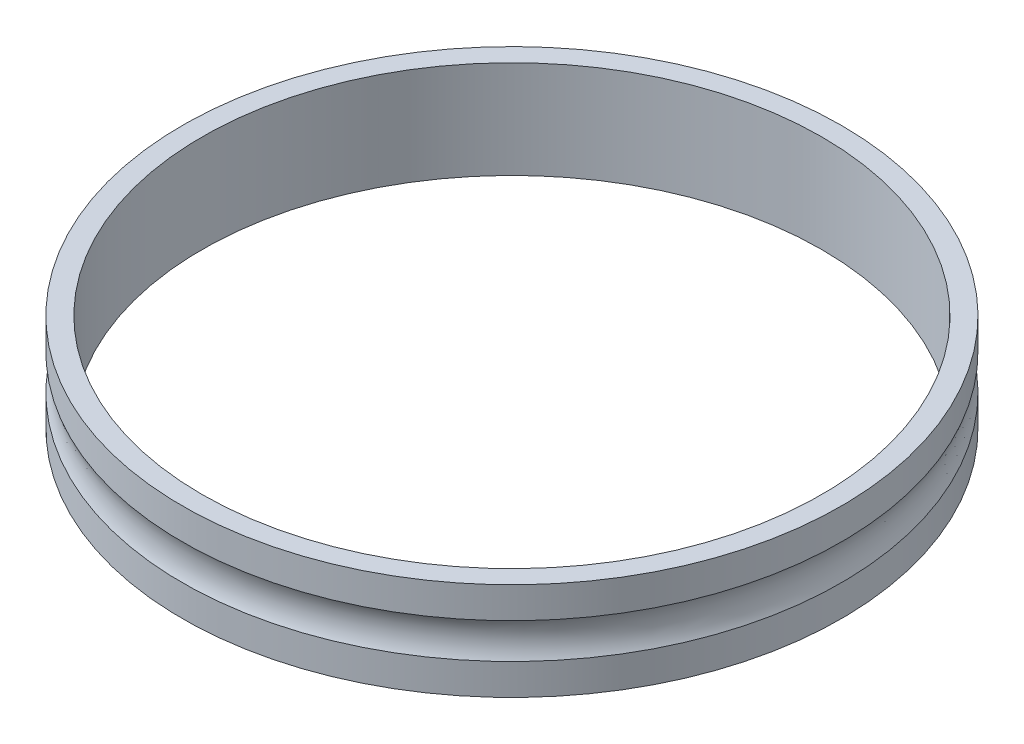
ISO-10303-21;
HEADER;
FILE_DESCRIPTION(('STEP AP214'),'2;1');
FILE_NAME('part.step','',(''),(''),'','','');
FILE_SCHEMA(('AUTOMOTIVE_DESIGN { 1 0 10303 214 1 1 1 1 }'));
ENDSEC;
DATA;
#1=APPLICATION_CONTEXT('core data for automotive mechanical design processes');
#2=APPLICATION_PROTOCOL_DEFINITION('international standard','automotive_design',2000,#1);
#3=PRODUCT_CONTEXT('',#1,'mechanical');
#4=PRODUCT('Part','Part','',(#3));
#5=PRODUCT_RELATED_PRODUCT_CATEGORY('part','',(#4));
#6=PRODUCT_DEFINITION_FORMATION('','',#4);
#7=PRODUCT_DEFINITION_CONTEXT('part definition',#1,'design');
#8=PRODUCT_DEFINITION('design','',#6,#7);
#9=PRODUCT_DEFINITION_SHAPE('','',#8);
#10=(LENGTH_UNIT() NAMED_UNIT(*) SI_UNIT(.MILLI.,.METRE.));
#11=(NAMED_UNIT(*) PLANE_ANGLE_UNIT() SI_UNIT($,.RADIAN.));
#12=(NAMED_UNIT(*) SI_UNIT($,.STERADIAN.) SOLID_ANGLE_UNIT());
#13=UNCERTAINTY_MEASURE_WITH_UNIT(LENGTH_MEASURE(1.E-05),#10,'distance_accuracy_value','');
#14=(GEOMETRIC_REPRESENTATION_CONTEXT(3) GLOBAL_UNCERTAINTY_ASSIGNED_CONTEXT((#13)) GLOBAL_UNIT_ASSIGNED_CONTEXT((#10,
#11,#12)) REPRESENTATION_CONTEXT('',''));
#15=CARTESIAN_POINT('',(0.,0.,0.));
#16=DIRECTION('',(0.,0.,1.));
#17=DIRECTION('',(1.,0.,0.));
#18=AXIS2_PLACEMENT_3D('',#15,#16,#17);
#19=CARTESIAN_POINT('',(12.535,-1.2,0.));
#20=DIRECTION('',(0.,-1.,0.));
#21=DIRECTION('',(0.,0.,-1.));
#22=AXIS2_PLACEMENT_3D('',#19,#20,#21);
#23=PLANE('',#22);
#24=CARTESIAN_POINT('',(0.,-1.2,0.));
#25=DIRECTION('',(0.,-1.,0.));
#26=DIRECTION('',(0.,0.,-1.));
#27=AXIS2_PLACEMENT_3D('',#24,#25,#26);
#28=CIRCLE('',#27,13.335);
#29=CARTESIAN_POINT('',(0.,-1.2,-13.335));
#30=VERTEX_POINT('',#29);
#31=EDGE_CURVE('E28',#30,#30,#28,.T.);
#32=ORIENTED_EDGE('',*,*,#31,.F.);
#33=EDGE_LOOP('',(#32));
#34=FACE_BOUND('',#33,.T.);
#35=CARTESIAN_POINT('',(0.,-1.2,0.));
#36=DIRECTION('',(0.,-1.,0.));
#37=DIRECTION('',(0.,0.,-1.));
#38=AXIS2_PLACEMENT_3D('',#35,#36,#37);
#39=CIRCLE('',#38,12.535);
#40=CARTESIAN_POINT('',(0.,-1.2,-12.535));
#41=VERTEX_POINT('',#40);
#42=EDGE_CURVE('E11',#41,#41,#39,.T.);
#43=ORIENTED_EDGE('',*,*,#42,.T.);
#44=EDGE_LOOP('',(#43));
#45=FACE_BOUND('',#44,.T.);
#46=ADVANCED_FACE('F17',(#34,#45),#23,.F.);
#47=CARTESIAN_POINT('',(0.,0.,0.));
#48=DIRECTION('',(0.,-1.,0.));
#49=DIRECTION('',(0.,0.,-1.));
#50=AXIS2_PLACEMENT_3D('',#47,#48,#49);
#51=CYLINDRICAL_SURFACE('',#50,13.335);
#52=CARTESIAN_POINT('',(0.,-2.46029184277775,0.));
#53=DIRECTION('',(0.,-1.,0.));
#54=DIRECTION('',(0.,0.,-1.));
#55=AXIS2_PLACEMENT_3D('',#52,#53,#54);
#56=CIRCLE('',#55,13.335);
#57=CARTESIAN_POINT('',(0.,-2.46029184277775,-13.335));
#58=VERTEX_POINT('',#57);
#59=EDGE_CURVE('E63',#58,#58,#56,.T.);
#60=ORIENTED_EDGE('',*,*,#59,.F.);
#61=EDGE_LOOP('',(#60));
#62=FACE_BOUND('',#61,.T.);
#63=ORIENTED_EDGE('',*,*,#31,.T.);
#64=EDGE_LOOP('',(#63));
#65=FACE_BOUND('',#64,.T.);
#66=ADVANCED_FACE('F72',(#62,#65),#51,.T.);
#67=CARTESIAN_POINT('',(0.,-3.175,0.));
#68=DIRECTION('',(0.,-1.,0.));
#69=DIRECTION('',(0.,0.,-1.));
#70=AXIS2_PLACEMENT_3D('',#67,#68,#69);
#71=TOROIDAL_SURFACE('',#70,14.7665,1.6);
#72=CARTESIAN_POINT('',(0.,-3.8897081572223,0.));
#73=DIRECTION('',(0.,-1.,0.));
#74=DIRECTION('',(0.,0.,-1.));
#75=AXIS2_PLACEMENT_3D('',#72,#73,#74);
#76=CIRCLE('',#75,13.335);
#77=CARTESIAN_POINT('',(0.,-3.8897081572223,-13.335));
#78=VERTEX_POINT('',#77);
#79=EDGE_CURVE('E59',#78,#78,#76,.T.);
#80=ORIENTED_EDGE('',*,*,#79,.F.);
#81=EDGE_LOOP('',(#80));
#82=FACE_BOUND('',#81,.T.);
#83=ORIENTED_EDGE('',*,*,#59,.T.);
#84=EDGE_LOOP('',(#83));
#85=FACE_BOUND('',#84,.T.);
#86=ADVANCED_FACE('F74',(#82,#85),#71,.F.);
#87=CARTESIAN_POINT('',(0.,0.,0.));
#88=DIRECTION('',(0.,-1.,0.));
#89=DIRECTION('',(0.,0.,-1.));
#90=AXIS2_PLACEMENT_3D('',#87,#88,#89);
#91=CYLINDRICAL_SURFACE('',#90,13.335);
#92=CARTESIAN_POINT('',(0.,-5.15,0.));
#93=DIRECTION('',(0.,-1.,0.));
#94=DIRECTION('',(0.,0.,-1.));
#95=AXIS2_PLACEMENT_3D('',#92,#93,#94);
#96=CIRCLE('',#95,13.335);
#97=CARTESIAN_POINT('',(0.,-5.15,-13.335));
#98=VERTEX_POINT('',#97);
#99=EDGE_CURVE('E47',#98,#98,#96,.T.);
#100=ORIENTED_EDGE('',*,*,#99,.F.);
#101=EDGE_LOOP('',(#100));
#102=FACE_BOUND('',#101,.T.);
#103=ORIENTED_EDGE('',*,*,#79,.T.);
#104=EDGE_LOOP('',(#103));
#105=FACE_BOUND('',#104,.T.);
#106=ADVANCED_FACE('F82',(#102,#105),#91,.T.);
#107=CARTESIAN_POINT('',(13.335,-5.15,0.));
#108=DIRECTION('',(0.,1.,0.));
#109=DIRECTION('',(0.,0.,1.));
#110=AXIS2_PLACEMENT_3D('',#107,#108,#109);
#111=PLANE('',#110);
#112=CARTESIAN_POINT('',(0.,-5.15,0.));
#113=DIRECTION('',(0.,-1.,0.));
#114=DIRECTION('',(0.,0.,-1.));
#115=AXIS2_PLACEMENT_3D('',#112,#113,#114);
#116=CIRCLE('',#115,12.535);
#117=CARTESIAN_POINT('',(0.,-5.15,-12.535));
#118=VERTEX_POINT('',#117);
#119=EDGE_CURVE('E21',#118,#118,#116,.T.);
#120=ORIENTED_EDGE('',*,*,#119,.F.);
#121=EDGE_LOOP('',(#120));
#122=FACE_BOUND('',#121,.T.);
#123=ORIENTED_EDGE('',*,*,#99,.T.);
#124=EDGE_LOOP('',(#123));
#125=FACE_BOUND('',#124,.T.);
#126=ADVANCED_FACE('F51',(#122,#125),#111,.F.);
#127=CARTESIAN_POINT('',(0.,0.,0.));
#128=DIRECTION('',(0.,-1.,0.));
#129=DIRECTION('',(0.,0.,-1.));
#130=AXIS2_PLACEMENT_3D('',#127,#128,#129);
#131=CYLINDRICAL_SURFACE('',#130,12.535);
#132=ORIENTED_EDGE('',*,*,#42,.F.);
#133=EDGE_LOOP('',(#132));
#134=FACE_BOUND('',#133,.T.);
#135=ORIENTED_EDGE('',*,*,#119,.T.);
#136=EDGE_LOOP('',(#135));
#137=FACE_BOUND('',#136,.T.);
#138=ADVANCED_FACE('F19',(#134,#137),#131,.F.);
#139=CLOSED_SHELL('',(#46,#66,#86,#106,#126,#138));
#140=MANIFOLD_SOLID_BREP('B1',#139);
#141=ADVANCED_BREP_SHAPE_REPRESENTATION('',(#18,#140),#14);
#142=SHAPE_DEFINITION_REPRESENTATION(#9,#141);
ENDSEC;
END-ISO-10303-21;
